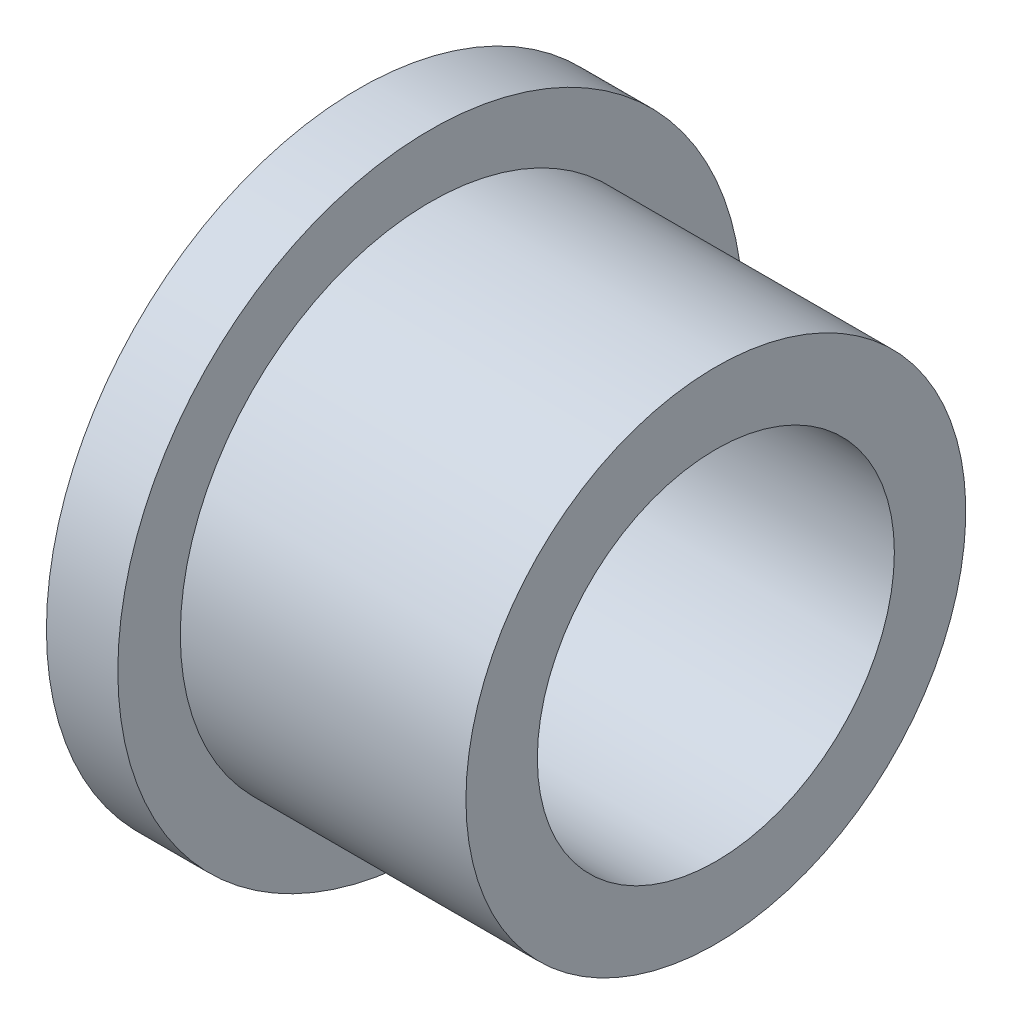
ISO-10303-21;
HEADER;
FILE_DESCRIPTION(('STEP AP214'),'2;1');
FILE_NAME('part.step','',(''),(''),'','','');
FILE_SCHEMA(('AUTOMOTIVE_DESIGN { 1 0 10303 214 1 1 1 1 }'));
ENDSEC;
DATA;
#1=APPLICATION_CONTEXT('core data for automotive mechanical design processes');
#2=APPLICATION_PROTOCOL_DEFINITION('international standard','automotive_design',2000,#1);
#3=PRODUCT_CONTEXT('',#1,'mechanical');
#4=PRODUCT('Part','Part','',(#3));
#5=PRODUCT_RELATED_PRODUCT_CATEGORY('part','',(#4));
#6=PRODUCT_DEFINITION_FORMATION('','',#4);
#7=PRODUCT_DEFINITION_CONTEXT('part definition',#1,'design');
#8=PRODUCT_DEFINITION('design','',#6,#7);
#9=PRODUCT_DEFINITION_SHAPE('','',#8);
#10=(LENGTH_UNIT() NAMED_UNIT(*) SI_UNIT(.MILLI.,.METRE.));
#11=(NAMED_UNIT(*) PLANE_ANGLE_UNIT() SI_UNIT($,.RADIAN.));
#12=(NAMED_UNIT(*) SI_UNIT($,.STERADIAN.) SOLID_ANGLE_UNIT());
#13=UNCERTAINTY_MEASURE_WITH_UNIT(LENGTH_MEASURE(1.E-05),#10,'distance_accuracy_value','');
#14=(GEOMETRIC_REPRESENTATION_CONTEXT(3) GLOBAL_UNCERTAINTY_ASSIGNED_CONTEXT((#13)) GLOBAL_UNIT_ASSIGNED_CONTEXT((#10,
#11,#12)) REPRESENTATION_CONTEXT('',''));
#15=CARTESIAN_POINT('',(0.,0.,0.));
#16=DIRECTION('',(0.,0.,1.));
#17=DIRECTION('',(1.,0.,0.));
#18=AXIS2_PLACEMENT_3D('',#15,#16,#17);
#19=CARTESIAN_POINT('',(0.,17.5,0.));
#20=DIRECTION('',(1.,0.,0.));
#21=DIRECTION('',(0.,0.,-1.));
#22=AXIS2_PLACEMENT_3D('',#19,#20,#21);
#23=PLANE('',#22);
#24=CARTESIAN_POINT('',(0.,0.,0.));
#25=DIRECTION('',(-1.,0.,0.));
#26=DIRECTION('',(0.,0.,1.));
#27=AXIS2_PLACEMENT_3D('',#24,#25,#26);
#28=CIRCLE('',#27,10.);
#29=CARTESIAN_POINT('',(0.,0.,10.));
#30=VERTEX_POINT('',#29);
#31=EDGE_CURVE('E10',#30,#30,#28,.T.);
#32=ORIENTED_EDGE('',*,*,#31,.F.);
#33=EDGE_LOOP('',(#32));
#34=FACE_BOUND('',#33,.T.);
#35=CARTESIAN_POINT('',(0.,0.,0.));
#36=DIRECTION('',(-1.,0.,0.));
#37=DIRECTION('',(0.,0.,1.));
#38=AXIS2_PLACEMENT_3D('',#35,#36,#37);
#39=CIRCLE('',#38,17.5);
#40=CARTESIAN_POINT('',(0.,0.,17.5));
#41=VERTEX_POINT('',#40);
#42=EDGE_CURVE('E57',#41,#41,#39,.T.);
#43=ORIENTED_EDGE('',*,*,#42,.T.);
#44=EDGE_LOOP('',(#43));
#45=FACE_BOUND('',#44,.T.);
#46=ADVANCED_FACE('F35',(#34,#45),#23,.F.);
#47=CARTESIAN_POINT('',(0.,0.,0.));
#48=DIRECTION('',(-1.,0.,0.));
#49=DIRECTION('',(0.,0.,1.));
#50=AXIS2_PLACEMENT_3D('',#47,#48,#49);
#51=CYLINDRICAL_SURFACE('',#50,10.);
#52=CARTESIAN_POINT('',(20.,0.,0.));
#53=DIRECTION('',(-1.,0.,0.));
#54=DIRECTION('',(0.,0.,1.));
#55=AXIS2_PLACEMENT_3D('',#52,#53,#54);
#56=CIRCLE('',#55,10.);
#57=CARTESIAN_POINT('',(20.,0.,10.));
#58=VERTEX_POINT('',#57);
#59=EDGE_CURVE('E41',#58,#58,#56,.T.);
#60=ORIENTED_EDGE('',*,*,#59,.F.);
#61=EDGE_LOOP('',(#60));
#62=FACE_BOUND('',#61,.T.);
#63=ORIENTED_EDGE('',*,*,#31,.T.);
#64=EDGE_LOOP('',(#63));
#65=FACE_BOUND('',#64,.T.);
#66=ADVANCED_FACE('F82',(#62,#65),#51,.F.);
#67=CARTESIAN_POINT('',(20.,10.,0.));
#68=DIRECTION('',(-1.,0.,0.));
#69=DIRECTION('',(0.,0.,1.));
#70=AXIS2_PLACEMENT_3D('',#67,#68,#69);
#71=PLANE('',#70);
#72=CARTESIAN_POINT('',(20.,0.,0.));
#73=DIRECTION('',(-1.,0.,0.));
#74=DIRECTION('',(0.,0.,1.));
#75=AXIS2_PLACEMENT_3D('',#72,#73,#74);
#76=CIRCLE('',#75,14.);
#77=CARTESIAN_POINT('',(20.,0.,14.));
#78=VERTEX_POINT('',#77);
#79=EDGE_CURVE('E45',#78,#78,#76,.T.);
#80=ORIENTED_EDGE('',*,*,#79,.F.);
#81=EDGE_LOOP('',(#80));
#82=FACE_BOUND('',#81,.T.);
#83=ORIENTED_EDGE('',*,*,#59,.T.);
#84=EDGE_LOOP('',(#83));
#85=FACE_BOUND('',#84,.T.);
#86=ADVANCED_FACE('F77',(#82,#85),#71,.F.);
#87=CARTESIAN_POINT('',(0.,0.,0.));
#88=DIRECTION('',(-1.,0.,0.));
#89=DIRECTION('',(0.,0.,1.));
#90=AXIS2_PLACEMENT_3D('',#87,#88,#89);
#91=CYLINDRICAL_SURFACE('',#90,14.);
#92=CARTESIAN_POINT('',(4.,0.,0.));
#93=DIRECTION('',(-1.,0.,0.));
#94=DIRECTION('',(0.,0.,1.));
#95=AXIS2_PLACEMENT_3D('',#92,#93,#94);
#96=CIRCLE('',#95,14.);
#97=CARTESIAN_POINT('',(4.,0.,14.));
#98=VERTEX_POINT('',#97);
#99=EDGE_CURVE('E49',#98,#98,#96,.T.);
#100=ORIENTED_EDGE('',*,*,#99,.F.);
#101=EDGE_LOOP('',(#100));
#102=FACE_BOUND('',#101,.T.);
#103=ORIENTED_EDGE('',*,*,#79,.T.);
#104=EDGE_LOOP('',(#103));
#105=FACE_BOUND('',#104,.T.);
#106=ADVANCED_FACE('F71',(#102,#105),#91,.T.);
#107=CARTESIAN_POINT('',(4.,14.,0.));
#108=DIRECTION('',(-1.,0.,0.));
#109=DIRECTION('',(0.,0.,1.));
#110=AXIS2_PLACEMENT_3D('',#107,#108,#109);
#111=PLANE('',#110);
#112=CARTESIAN_POINT('',(4.,0.,0.));
#113=DIRECTION('',(-1.,0.,0.));
#114=DIRECTION('',(0.,0.,1.));
#115=AXIS2_PLACEMENT_3D('',#112,#113,#114);
#116=CIRCLE('',#115,17.5);
#117=CARTESIAN_POINT('',(4.,0.,17.5));
#118=VERTEX_POINT('',#117);
#119=EDGE_CURVE('E54',#118,#118,#116,.T.);
#120=ORIENTED_EDGE('',*,*,#119,.F.);
#121=EDGE_LOOP('',(#120));
#122=FACE_BOUND('',#121,.T.);
#123=ORIENTED_EDGE('',*,*,#99,.T.);
#124=EDGE_LOOP('',(#123));
#125=FACE_BOUND('',#124,.T.);
#126=ADVANCED_FACE('F65',(#122,#125),#111,.F.);
#127=CARTESIAN_POINT('',(0.,0.,0.));
#128=DIRECTION('',(-1.,0.,0.));
#129=DIRECTION('',(0.,0.,1.));
#130=AXIS2_PLACEMENT_3D('',#127,#128,#129);
#131=CYLINDRICAL_SURFACE('',#130,17.5);
#132=ORIENTED_EDGE('',*,*,#42,.F.);
#133=EDGE_LOOP('',(#132));
#134=FACE_BOUND('',#133,.T.);
#135=ORIENTED_EDGE('',*,*,#119,.T.);
#136=EDGE_LOOP('',(#135));
#137=FACE_BOUND('',#136,.T.);
#138=ADVANCED_FACE('F62',(#134,#137),#131,.T.);
#139=CLOSED_SHELL('',(#46,#66,#86,#106,#126,#138));
#140=MANIFOLD_SOLID_BREP('B2',#139);
#141=ADVANCED_BREP_SHAPE_REPRESENTATION('',(#18,#140),#14);
#142=SHAPE_DEFINITION_REPRESENTATION(#9,#141);
ENDSEC;
END-ISO-10303-21;
